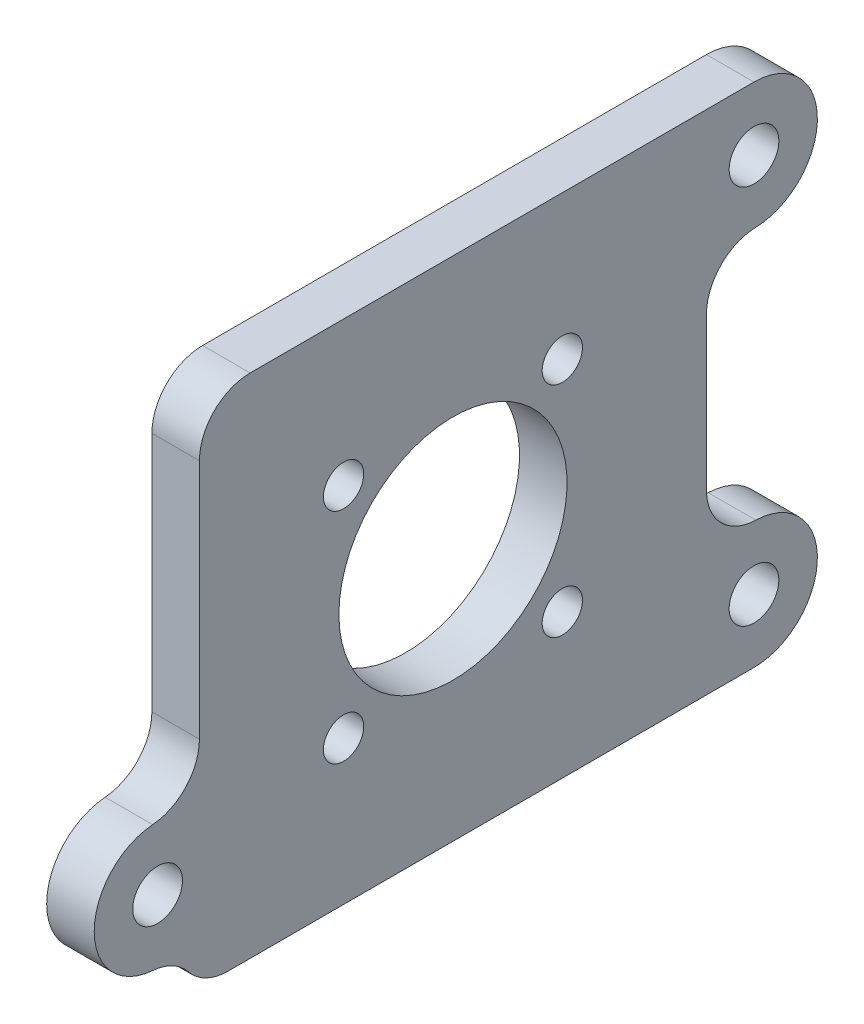
ISO-10303-21;
HEADER;
FILE_DESCRIPTION(('STEP AP214'),'2;1');
FILE_NAME('part.step','',(''),(''),'','','');
FILE_SCHEMA(('AUTOMOTIVE_DESIGN { 1 0 10303 214 1 1 1 1 }'));
ENDSEC;
DATA;
#1=APPLICATION_CONTEXT('core data for automotive mechanical design processes');
#2=APPLICATION_PROTOCOL_DEFINITION('international standard','automotive_design',2000,#1);
#3=PRODUCT_CONTEXT('',#1,'mechanical');
#4=PRODUCT('Part','Part','',(#3));
#5=PRODUCT_RELATED_PRODUCT_CATEGORY('part','',(#4));
#6=PRODUCT_DEFINITION_FORMATION('','',#4);
#7=PRODUCT_DEFINITION_CONTEXT('part definition',#1,'design');
#8=PRODUCT_DEFINITION('design','',#6,#7);
#9=PRODUCT_DEFINITION_SHAPE('','',#8);
#10=(LENGTH_UNIT() NAMED_UNIT(*) SI_UNIT(.MILLI.,.METRE.));
#11=(NAMED_UNIT(*) PLANE_ANGLE_UNIT() SI_UNIT($,.RADIAN.));
#12=(NAMED_UNIT(*) SI_UNIT($,.STERADIAN.) SOLID_ANGLE_UNIT());
#13=UNCERTAINTY_MEASURE_WITH_UNIT(LENGTH_MEASURE(1.E-05),#10,'distance_accuracy_value','');
#14=(GEOMETRIC_REPRESENTATION_CONTEXT(3) GLOBAL_UNCERTAINTY_ASSIGNED_CONTEXT((#13)) GLOBAL_UNIT_ASSIGNED_CONTEXT((#10,
#11,#12)) REPRESENTATION_CONTEXT('',''));
#15=CARTESIAN_POINT('',(0.,0.,0.));
#16=DIRECTION('',(0.,0.,1.));
#17=DIRECTION('',(1.,0.,0.));
#18=AXIS2_PLACEMENT_3D('',#15,#16,#17);
#19=CARTESIAN_POINT('',(4.7625,7.62441057319142,-30.48));
#20=DIRECTION('',(-1.,0.,0.));
#21=DIRECTION('',(0.,0.,1.));
#22=AXIS2_PLACEMENT_3D('',#19,#20,#21);
#23=PLANE('',#22);
#24=CARTESIAN_POINT('',(4.7625,-15.24,29.591));
#25=DIRECTION('',(1.,0.,0.));
#26=DIRECTION('',(0.,0.,-1.));
#27=AXIS2_PLACEMENT_3D('',#24,#25,#26);
#28=CIRCLE('',#27,2.4892);
#29=CARTESIAN_POINT('',(4.7625,-15.24,27.1018));
#30=VERTEX_POINT('',#29);
#31=EDGE_CURVE('E181',#30,#30,#28,.T.);
#32=ORIENTED_EDGE('',*,*,#31,.F.);
#33=EDGE_LOOP('',(#32));
#34=FACE_BOUND('',#33,.T.);
#35=CARTESIAN_POINT('',(4.7625,19.05,-30.1625));
#36=DIRECTION('',(1.,0.,0.));
#37=DIRECTION('',(0.,0.,-1.));
#38=AXIS2_PLACEMENT_3D('',#35,#36,#37);
#39=CIRCLE('',#38,2.4892);
#40=CARTESIAN_POINT('',(4.7625,19.05,-32.6517));
#41=VERTEX_POINT('',#40);
#42=EDGE_CURVE('E199',#41,#41,#39,.T.);
#43=ORIENTED_EDGE('',*,*,#42,.F.);
#44=EDGE_LOOP('',(#43));
#45=FACE_BOUND('',#44,.T.);
#46=CARTESIAN_POINT('',(4.7625,-19.05,-30.1625));
#47=DIRECTION('',(1.,0.,0.));
#48=DIRECTION('',(0.,0.,-1.));
#49=AXIS2_PLACEMENT_3D('',#46,#47,#48);
#50=CIRCLE('',#49,2.4892);
#51=CARTESIAN_POINT('',(4.7625,-19.05,-32.6517));
#52=VERTEX_POINT('',#51);
#53=EDGE_CURVE('E205',#52,#52,#50,.T.);
#54=ORIENTED_EDGE('',*,*,#53,.F.);
#55=EDGE_LOOP('',(#54));
#56=FACE_BOUND('',#55,.T.);
#57=CARTESIAN_POINT('',(4.7625,10.9601,10.9601));
#58=DIRECTION('',(1.,0.,0.));
#59=DIRECTION('',(0.,0.,-1.));
#60=AXIS2_PLACEMENT_3D('',#57,#58,#59);
#61=CIRCLE('',#60,2.0193);
#62=CARTESIAN_POINT('',(4.7625,10.9601,8.9408));
#63=VERTEX_POINT('',#62);
#64=EDGE_CURVE('E211',#63,#63,#61,.T.);
#65=ORIENTED_EDGE('',*,*,#64,.F.);
#66=EDGE_LOOP('',(#65));
#67=FACE_BOUND('',#66,.T.);
#68=CARTESIAN_POINT('',(4.7625,-10.9601,10.9601));
#69=DIRECTION('',(1.,0.,0.));
#70=DIRECTION('',(0.,0.,-1.));
#71=AXIS2_PLACEMENT_3D('',#68,#69,#70);
#72=CIRCLE('',#71,2.0193);
#73=CARTESIAN_POINT('',(4.7625,-10.9601,8.94079999999999));
#74=VERTEX_POINT('',#73);
#75=EDGE_CURVE('E214',#74,#74,#72,.T.);
#76=ORIENTED_EDGE('',*,*,#75,.F.);
#77=EDGE_LOOP('',(#76));
#78=FACE_BOUND('',#77,.T.);
#79=CARTESIAN_POINT('',(4.7625,-10.9601,-10.9601));
#80=DIRECTION('',(1.,0.,0.));
#81=DIRECTION('',(0.,0.,-1.));
#82=AXIS2_PLACEMENT_3D('',#79,#80,#81);
#83=CIRCLE('',#82,2.0193);
#84=CARTESIAN_POINT('',(4.7625,-10.9601,-12.9794));
#85=VERTEX_POINT('',#84);
#86=EDGE_CURVE('E217',#85,#85,#83,.T.);
#87=ORIENTED_EDGE('',*,*,#86,.F.);
#88=EDGE_LOOP('',(#87));
#89=FACE_BOUND('',#88,.T.);
#90=CARTESIAN_POINT('',(4.7625,10.9601,-10.9601));
#91=DIRECTION('',(1.,0.,0.));
#92=DIRECTION('',(0.,0.,-1.));
#93=AXIS2_PLACEMENT_3D('',#90,#91,#92);
#94=CIRCLE('',#93,2.0193);
#95=CARTESIAN_POINT('',(4.7625,10.9601,-12.9794));
#96=VERTEX_POINT('',#95);
#97=EDGE_CURVE('E220',#96,#96,#94,.T.);
#98=ORIENTED_EDGE('',*,*,#97,.F.);
#99=EDGE_LOOP('',(#98));
#100=FACE_BOUND('',#99,.T.);
#101=CARTESIAN_POINT('',(4.7625,-26.63537533388,30.48));
#102=DIRECTION('',(-1.,0.,0.));
#103=DIRECTION('',(0.,0.,1.));
#104=AXIS2_PLACEMENT_3D('',#101,#102,#103);
#105=CIRCLE('',#104,5.08);
#106=CARTESIAN_POINT('',(4.7625,-21.5707640743778,30.0848888888889));
#107=VERTEX_POINT('',#106);
#108=CARTESIAN_POINT('',(4.7625,-23.47768766694,26.5006271099512));
#109=VERTEX_POINT('',#108);
#110=EDGE_CURVE('E236',#107,#109,#105,.T.);
#111=ORIENTED_EDGE('',*,*,#110,.T.);
#112=CARTESIAN_POINT('',(4.7625,-20.3200000000001,22.5212542199024));
#113=DIRECTION('',(-1.,0.,0.));
#114=DIRECTION('',(0.,0.,1.));
#115=AXIS2_PLACEMENT_3D('',#112,#113,#114);
#116=CIRCLE('',#115,5.08);
#117=CARTESIAN_POINT('',(4.7625,-25.4,22.5212542199024));
#118=VERTEX_POINT('',#117);
#119=EDGE_CURVE('E176',#109,#118,#116,.F.);
#120=ORIENTED_EDGE('',*,*,#119,.T.);
#121=DIRECTION('',(0.,0.,-1.));
#122=VECTOR('',#121,1.);
#123=CARTESIAN_POINT('',(4.7625,-25.4,25.4));
#124=LINE('',#123,#122);
#125=CARTESIAN_POINT('',(4.7625,-25.4,-30.1625));
#126=VERTEX_POINT('',#125);
#127=EDGE_CURVE('E238',#118,#126,#124,.T.);
#128=ORIENTED_EDGE('',*,*,#127,.T.);
#129=CARTESIAN_POINT('',(4.7625,-19.05,-30.1625));
#130=DIRECTION('',(1.,0.,0.));
#131=DIRECTION('',(0.,0.,-1.));
#132=AXIS2_PLACEMENT_3D('',#129,#130,#131);
#133=CIRCLE('',#132,6.35);
#134=CARTESIAN_POINT('',(4.7625,-12.7024503184397,-30.3388888888889));
#135=VERTEX_POINT('',#134);
#136=EDGE_CURVE('E240',#126,#135,#133,.T.);
#137=ORIENTED_EDGE('',*,*,#136,.T.);
#138=CARTESIAN_POINT('',(4.7625,-7.62441057319142,-30.48));
#139=DIRECTION('',(-1.,0.,0.));
#140=DIRECTION('',(0.,0.,-1.));
#141=AXIS2_PLACEMENT_3D('',#138,#139,#140);
#142=CIRCLE('',#141,5.08);
#143=CARTESIAN_POINT('',(4.7625,-7.62441057319142,-25.4));
#144=VERTEX_POINT('',#143);
#145=EDGE_CURVE('E242',#135,#144,#142,.T.);
#146=ORIENTED_EDGE('',*,*,#145,.T.);
#147=DIRECTION('',(0.,1.,0.));
#148=VECTOR('',#147,1.);
#149=CARTESIAN_POINT('',(4.7625,7.62441057319142,-25.4));
#150=LINE('',#149,#148);
#151=CARTESIAN_POINT('',(4.7625,7.62441057319142,-25.4));
#152=VERTEX_POINT('',#151);
#153=EDGE_CURVE('E152',#144,#152,#150,.T.);
#154=ORIENTED_EDGE('',*,*,#153,.T.);
#155=CARTESIAN_POINT('',(4.7625,7.62441057319142,-30.48));
#156=DIRECTION('',(-1.,0.,0.));
#157=DIRECTION('',(0.,0.,1.));
#158=AXIS2_PLACEMENT_3D('',#155,#156,#157);
#159=CIRCLE('',#158,5.08);
#160=CARTESIAN_POINT('',(4.7625,12.7024503184397,-30.3388888888889));
#161=VERTEX_POINT('',#160);
#162=EDGE_CURVE('E146',#152,#161,#159,.T.);
#163=ORIENTED_EDGE('',*,*,#162,.T.);
#164=CARTESIAN_POINT('',(4.7625,19.05,-30.1625));
#165=DIRECTION('',(1.,0.,0.));
#166=DIRECTION('',(0.,0.,-1.));
#167=AXIS2_PLACEMENT_3D('',#164,#165,#166);
#168=CIRCLE('',#167,6.35);
#169=CARTESIAN_POINT('',(4.7625,25.4,-30.1625));
#170=VERTEX_POINT('',#169);
#171=EDGE_CURVE('E136',#161,#170,#168,.T.);
#172=ORIENTED_EDGE('',*,*,#171,.T.);
#173=DIRECTION('',(0.,0.,1.));
#174=VECTOR('',#173,1.);
#175=CARTESIAN_POINT('',(4.7625,25.4,-25.4));
#176=LINE('',#175,#174);
#177=CARTESIAN_POINT('',(4.7625,25.3999999999999,20.32));
#178=VERTEX_POINT('',#177);
#179=EDGE_CURVE('E145',#170,#178,#176,.T.);
#180=ORIENTED_EDGE('',*,*,#179,.T.);
#181=CARTESIAN_POINT('',(4.7625,20.32,20.32));
#182=DIRECTION('',(-1.,0.,0.));
#183=DIRECTION('',(0.,0.,1.));
#184=AXIS2_PLACEMENT_3D('',#181,#182,#183);
#185=CIRCLE('',#184,5.08);
#186=CARTESIAN_POINT('',(4.7625,20.32,25.4));
#187=VERTEX_POINT('',#186);
#188=EDGE_CURVE('E56',#178,#187,#185,.F.);
#189=ORIENTED_EDGE('',*,*,#188,.T.);
#190=DIRECTION('',(0.,-1.,0.));
#191=VECTOR('',#190,1.);
#192=CARTESIAN_POINT('',(4.7625,25.4,25.4));
#193=LINE('',#192,#191);
#194=CARTESIAN_POINT('',(4.7625,-3.84462466612003,25.4));
#195=VERTEX_POINT('',#194);
#196=EDGE_CURVE('E230',#187,#195,#193,.T.);
#197=ORIENTED_EDGE('',*,*,#196,.T.);
#198=CARTESIAN_POINT('',(4.7625,-3.84462466612003,30.48));
#199=DIRECTION('',(-1.,0.,0.));
#200=DIRECTION('',(0.,0.,-1.));
#201=AXIS2_PLACEMENT_3D('',#198,#199,#200);
#202=CIRCLE('',#201,5.08);
#203=CARTESIAN_POINT('',(4.7625,-8.90923592562224,30.0848888888889));
#204=VERTEX_POINT('',#203);
#205=EDGE_CURVE('E232',#195,#204,#202,.T.);
#206=ORIENTED_EDGE('',*,*,#205,.T.);
#207=CARTESIAN_POINT('',(4.7625,-15.24,29.591));
#208=DIRECTION('',(1.,0.,0.));
#209=DIRECTION('',(0.,0.,-1.));
#210=AXIS2_PLACEMENT_3D('',#207,#208,#209);
#211=CIRCLE('',#210,6.35);
#212=EDGE_CURVE('E234',#204,#107,#211,.T.);
#213=ORIENTED_EDGE('',*,*,#212,.T.);
#214=EDGE_LOOP('',(#111,#120,#128,#137,#146,#154,#163,#172,#180,#189,#197,#206,#213));
#215=FACE_BOUND('',#214,.T.);
#216=CARTESIAN_POINT('',(4.7625,0.,0.));
#217=DIRECTION('',(1.,0.,0.));
#218=DIRECTION('',(0.,0.,-1.));
#219=AXIS2_PLACEMENT_3D('',#216,#217,#218);
#220=CIRCLE('',#219,11.43);
#221=CARTESIAN_POINT('',(4.7625,0.,11.43));
#222=VERTEX_POINT('',#221);
#223=EDGE_CURVE('E224',#222,#222,#220,.T.);
#224=ORIENTED_EDGE('',*,*,#223,.F.);
#225=EDGE_LOOP('',(#224));
#226=FACE_BOUND('',#225,.T.);
#227=ADVANCED_FACE('F39',(#34,#45,#56,#67,#78,#89,#100,#215,#226),#23,.F.);
#228=CARTESIAN_POINT('',(0.,7.62441057319142,-30.48));
#229=DIRECTION('',(-1.,0.,0.));
#230=DIRECTION('',(0.,0.,1.));
#231=AXIS2_PLACEMENT_3D('',#228,#229,#230);
#232=PLANE('',#231);
#233=CARTESIAN_POINT('',(0.,-10.9601,10.9601));
#234=DIRECTION('',(-1.,0.,0.));
#235=DIRECTION('',(0.,0.,1.));
#236=AXIS2_PLACEMENT_3D('',#233,#234,#235);
#237=CIRCLE('',#236,3.5433);
#238=CARTESIAN_POINT('',(0.,-10.9601,14.5034));
#239=VERTEX_POINT('',#238);
#240=EDGE_CURVE('E594',#239,#239,#237,.T.);
#241=ORIENTED_EDGE('',*,*,#240,.F.);
#242=EDGE_LOOP('',(#241));
#243=FACE_BOUND('',#242,.T.);
#244=CARTESIAN_POINT('',(0.,-10.9601,-10.9601));
#245=DIRECTION('',(-1.,0.,0.));
#246=DIRECTION('',(0.,0.,1.));
#247=AXIS2_PLACEMENT_3D('',#244,#245,#246);
#248=CIRCLE('',#247,3.5433);
#249=CARTESIAN_POINT('',(0.,-10.9601,-7.41680000000001));
#250=VERTEX_POINT('',#249);
#251=EDGE_CURVE('E598',#250,#250,#248,.T.);
#252=ORIENTED_EDGE('',*,*,#251,.F.);
#253=EDGE_LOOP('',(#252));
#254=FACE_BOUND('',#253,.T.);
#255=CARTESIAN_POINT('',(0.,10.9601,-10.9601));
#256=DIRECTION('',(-1.,0.,0.));
#257=DIRECTION('',(0.,0.,1.));
#258=AXIS2_PLACEMENT_3D('',#255,#256,#257);
#259=CIRCLE('',#258,3.5433);
#260=CARTESIAN_POINT('',(0.,10.9601,-7.41680000000001));
#261=VERTEX_POINT('',#260);
#262=EDGE_CURVE('E193',#261,#261,#259,.T.);
#263=ORIENTED_EDGE('',*,*,#262,.F.);
#264=EDGE_LOOP('',(#263));
#265=FACE_BOUND('',#264,.T.);
#266=CARTESIAN_POINT('',(0.,10.9601,10.9601));
#267=DIRECTION('',(-1.,0.,0.));
#268=DIRECTION('',(0.,0.,1.));
#269=AXIS2_PLACEMENT_3D('',#266,#267,#268);
#270=CIRCLE('',#269,3.5433);
#271=CARTESIAN_POINT('',(0.,10.9601,14.5034));
#272=VERTEX_POINT('',#271);
#273=EDGE_CURVE('E182',#272,#272,#270,.T.);
#274=ORIENTED_EDGE('',*,*,#273,.F.);
#275=EDGE_LOOP('',(#274));
#276=FACE_BOUND('',#275,.T.);
#277=CARTESIAN_POINT('',(0.,-15.24,29.591));
#278=DIRECTION('',(1.,0.,0.));
#279=DIRECTION('',(0.,0.,-1.));
#280=AXIS2_PLACEMENT_3D('',#277,#278,#279);
#281=CIRCLE('',#280,2.4892);
#282=CARTESIAN_POINT('',(0.,-15.24,27.1018));
#283=VERTEX_POINT('',#282);
#284=EDGE_CURVE('E186',#283,#283,#281,.T.);
#285=ORIENTED_EDGE('',*,*,#284,.T.);
#286=EDGE_LOOP('',(#285));
#287=FACE_BOUND('',#286,.T.);
#288=CARTESIAN_POINT('',(0.,19.05,-30.1625));
#289=DIRECTION('',(1.,0.,0.));
#290=DIRECTION('',(0.,0.,-1.));
#291=AXIS2_PLACEMENT_3D('',#288,#289,#290);
#292=CIRCLE('',#291,2.4892);
#293=CARTESIAN_POINT('',(0.,19.05,-32.6517));
#294=VERTEX_POINT('',#293);
#295=EDGE_CURVE('E202',#294,#294,#292,.T.);
#296=ORIENTED_EDGE('',*,*,#295,.T.);
#297=EDGE_LOOP('',(#296));
#298=FACE_BOUND('',#297,.T.);
#299=CARTESIAN_POINT('',(0.,-19.05,-30.1625));
#300=DIRECTION('',(1.,0.,0.));
#301=DIRECTION('',(0.,0.,-1.));
#302=AXIS2_PLACEMENT_3D('',#299,#300,#301);
#303=CIRCLE('',#302,2.4892);
#304=CARTESIAN_POINT('',(0.,-19.05,-32.6517));
#305=VERTEX_POINT('',#304);
#306=EDGE_CURVE('E208',#305,#305,#303,.T.);
#307=ORIENTED_EDGE('',*,*,#306,.T.);
#308=EDGE_LOOP('',(#307));
#309=FACE_BOUND('',#308,.T.);
#310=DIRECTION('',(0.,0.,-1.));
#311=VECTOR('',#310,1.);
#312=CARTESIAN_POINT('',(0.,-25.4,-25.4));
#313=LINE('',#312,#311);
#314=CARTESIAN_POINT('',(0.,-25.4000000000001,22.5212542199024));
#315=VERTEX_POINT('',#314);
#316=CARTESIAN_POINT('',(0.,-25.4,-30.1625));
#317=VERTEX_POINT('',#316);
#318=EDGE_CURVE('E260',#315,#317,#313,.T.);
#319=ORIENTED_EDGE('',*,*,#318,.F.);
#320=CARTESIAN_POINT('',(0.,-20.3200000000001,22.5212542199024));
#321=DIRECTION('',(-1.,0.,0.));
#322=DIRECTION('',(0.,0.,1.));
#323=AXIS2_PLACEMENT_3D('',#320,#321,#322);
#324=CIRCLE('',#323,5.08);
#325=CARTESIAN_POINT('',(0.,-23.47768766694,26.5006271099512));
#326=VERTEX_POINT('',#325);
#327=EDGE_CURVE('E171',#315,#326,#324,.T.);
#328=ORIENTED_EDGE('',*,*,#327,.T.);
#329=CARTESIAN_POINT('',(0.,-26.63537533388,30.48));
#330=DIRECTION('',(-1.,0.,0.));
#331=DIRECTION('',(0.,0.,1.));
#332=AXIS2_PLACEMENT_3D('',#329,#330,#331);
#333=CIRCLE('',#332,5.08);
#334=CARTESIAN_POINT('',(0.,-21.5707640743778,30.0848888888889));
#335=VERTEX_POINT('',#334);
#336=EDGE_CURVE('E257',#335,#326,#333,.T.);
#337=ORIENTED_EDGE('',*,*,#336,.F.);
#338=CARTESIAN_POINT('',(0.,-15.24,29.591));
#339=DIRECTION('',(1.,0.,0.));
#340=DIRECTION('',(0.,0.,-1.));
#341=AXIS2_PLACEMENT_3D('',#338,#339,#340);
#342=CIRCLE('',#341,6.35);
#343=CARTESIAN_POINT('',(0.,-8.90923592562224,30.0848888888889));
#344=VERTEX_POINT('',#343);
#345=EDGE_CURVE('E255',#344,#335,#342,.T.);
#346=ORIENTED_EDGE('',*,*,#345,.F.);
#347=CARTESIAN_POINT('',(0.,-3.84462466612003,30.48));
#348=DIRECTION('',(-1.,0.,0.));
#349=DIRECTION('',(0.,0.,-1.));
#350=AXIS2_PLACEMENT_3D('',#347,#348,#349);
#351=CIRCLE('',#350,5.08);
#352=CARTESIAN_POINT('',(0.,-3.84462466612003,25.4));
#353=VERTEX_POINT('',#352);
#354=EDGE_CURVE('E253',#353,#344,#351,.T.);
#355=ORIENTED_EDGE('',*,*,#354,.F.);
#356=DIRECTION('',(0.,-1.,0.));
#357=VECTOR('',#356,1.);
#358=CARTESIAN_POINT('',(0.,25.4,25.4));
#359=LINE('',#358,#357);
#360=CARTESIAN_POINT('',(0.,20.32,25.4));
#361=VERTEX_POINT('',#360);
#362=EDGE_CURVE('E251',#361,#353,#359,.T.);
#363=ORIENTED_EDGE('',*,*,#362,.F.);
#364=CARTESIAN_POINT('',(0.,20.32,20.32));
#365=DIRECTION('',(-1.,0.,0.));
#366=DIRECTION('',(0.,0.,1.));
#367=AXIS2_PLACEMENT_3D('',#364,#365,#366);
#368=CIRCLE('',#367,5.08);
#369=CARTESIAN_POINT('',(0.,25.4,20.32));
#370=VERTEX_POINT('',#369);
#371=EDGE_CURVE('E164',#361,#370,#368,.T.);
#372=ORIENTED_EDGE('',*,*,#371,.T.);
#373=DIRECTION('',(0.,0.,1.));
#374=VECTOR('',#373,1.);
#375=CARTESIAN_POINT('',(0.,25.4,25.4));
#376=LINE('',#375,#374);
#377=CARTESIAN_POINT('',(0.,25.4,-30.1625));
#378=VERTEX_POINT('',#377);
#379=EDGE_CURVE('E249',#378,#370,#376,.T.);
#380=ORIENTED_EDGE('',*,*,#379,.F.);
#381=CARTESIAN_POINT('',(0.,19.05,-30.1625));
#382=DIRECTION('',(1.,0.,0.));
#383=DIRECTION('',(0.,0.,-1.));
#384=AXIS2_PLACEMENT_3D('',#381,#382,#383);
#385=CIRCLE('',#384,6.35);
#386=CARTESIAN_POINT('',(0.,12.7024503184397,-30.3388888888889));
#387=VERTEX_POINT('',#386);
#388=EDGE_CURVE('E247',#387,#378,#385,.T.);
#389=ORIENTED_EDGE('',*,*,#388,.F.);
#390=CARTESIAN_POINT('',(0.,7.62441057319142,-30.48));
#391=DIRECTION('',(-1.,0.,0.));
#392=DIRECTION('',(0.,0.,1.));
#393=AXIS2_PLACEMENT_3D('',#390,#391,#392);
#394=CIRCLE('',#393,5.08);
#395=CARTESIAN_POINT('',(0.,7.62441057319142,-25.4));
#396=VERTEX_POINT('',#395);
#397=EDGE_CURVE('E160',#396,#387,#394,.T.);
#398=ORIENTED_EDGE('',*,*,#397,.F.);
#399=DIRECTION('',(0.,1.,0.));
#400=VECTOR('',#399,1.);
#401=CARTESIAN_POINT('',(0.,7.62441057319142,-25.4));
#402=LINE('',#401,#400);
#403=CARTESIAN_POINT('',(0.,-7.62441057319142,-25.4));
#404=VERTEX_POINT('',#403);
#405=EDGE_CURVE('E156',#404,#396,#402,.T.);
#406=ORIENTED_EDGE('',*,*,#405,.F.);
#407=CARTESIAN_POINT('',(0.,-7.62441057319142,-30.48));
#408=DIRECTION('',(-1.,0.,0.));
#409=DIRECTION('',(0.,0.,-1.));
#410=AXIS2_PLACEMENT_3D('',#407,#408,#409);
#411=CIRCLE('',#410,5.08);
#412=CARTESIAN_POINT('',(0.,-12.7024503184397,-30.3388888888889));
#413=VERTEX_POINT('',#412);
#414=EDGE_CURVE('E264',#413,#404,#411,.T.);
#415=ORIENTED_EDGE('',*,*,#414,.F.);
#416=CARTESIAN_POINT('',(0.,-19.05,-30.1625));
#417=DIRECTION('',(1.,0.,0.));
#418=DIRECTION('',(0.,0.,-1.));
#419=AXIS2_PLACEMENT_3D('',#416,#417,#418);
#420=CIRCLE('',#419,6.35);
#421=EDGE_CURVE('E262',#317,#413,#420,.T.);
#422=ORIENTED_EDGE('',*,*,#421,.F.);
#423=EDGE_LOOP('',(#319,#328,#337,#346,#355,#363,#372,#380,#389,#398,#406,#415,#422));
#424=FACE_BOUND('',#423,.T.);
#425=CARTESIAN_POINT('',(0.,0.,0.));
#426=DIRECTION('',(1.,0.,0.));
#427=DIRECTION('',(0.,0.,-1.));
#428=AXIS2_PLACEMENT_3D('',#425,#426,#427);
#429=CIRCLE('',#428,11.43);
#430=CARTESIAN_POINT('',(0.,0.,11.43));
#431=VERTEX_POINT('',#430);
#432=EDGE_CURVE('E223',#431,#431,#429,.T.);
#433=ORIENTED_EDGE('',*,*,#432,.T.);
#434=EDGE_LOOP('',(#433));
#435=FACE_BOUND('',#434,.T.);
#436=ADVANCED_FACE('F294',(#243,#254,#265,#276,#287,#298,#309,#424,#435),#232,.T.);
#437=CARTESIAN_POINT('',(4.7625,7.62441057319142,-30.48));
#438=DIRECTION('',(-1.,0.,0.));
#439=DIRECTION('',(0.,0.,1.));
#440=AXIS2_PLACEMENT_3D('',#437,#438,#439);
#441=CYLINDRICAL_SURFACE('',#440,5.08);
#442=ORIENTED_EDGE('',*,*,#397,.T.);
#443=DIRECTION('',(-1.,0.,0.));
#444=VECTOR('',#443,1.);
#445=CARTESIAN_POINT('',(4.7625,12.7024503184397,-30.3388888888889));
#446=LINE('',#445,#444);
#447=EDGE_CURVE('E141',#161,#387,#446,.T.);
#448=ORIENTED_EDGE('',*,*,#447,.F.);
#449=ORIENTED_EDGE('',*,*,#162,.F.);
#450=DIRECTION('',(-1.,0.,0.));
#451=VECTOR('',#450,1.);
#452=CARTESIAN_POINT('',(4.7625,7.62441057319142,-25.4));
#453=LINE('',#452,#451);
#454=EDGE_CURVE('E245',#152,#396,#453,.T.);
#455=ORIENTED_EDGE('',*,*,#454,.T.);
#456=EDGE_LOOP('',(#442,#448,#449,#455));
#457=FACE_BOUND('',#456,.T.);
#458=ADVANCED_FACE('F158',(#457),#441,.F.);
#459=CARTESIAN_POINT('',(4.7625,19.05,-30.1625));
#460=DIRECTION('',(-1.,0.,0.));
#461=DIRECTION('',(0.,0.,1.));
#462=AXIS2_PLACEMENT_3D('',#459,#460,#461);
#463=CYLINDRICAL_SURFACE('',#462,6.35);
#464=ORIENTED_EDGE('',*,*,#388,.T.);
#465=DIRECTION('',(-1.,0.,0.));
#466=VECTOR('',#465,1.);
#467=CARTESIAN_POINT('',(4.7625,25.4,-30.1625));
#468=LINE('',#467,#466);
#469=EDGE_CURVE('E144',#170,#378,#468,.T.);
#470=ORIENTED_EDGE('',*,*,#469,.F.);
#471=ORIENTED_EDGE('',*,*,#171,.F.);
#472=ORIENTED_EDGE('',*,*,#447,.T.);
#473=EDGE_LOOP('',(#464,#470,#471,#472));
#474=FACE_BOUND('',#473,.T.);
#475=ADVANCED_FACE('F139',(#474),#463,.T.);
#476=CARTESIAN_POINT('',(4.7625,25.4,25.4));
#477=DIRECTION('',(0.,-1.,0.));
#478=DIRECTION('',(0.,0.,-1.));
#479=AXIS2_PLACEMENT_3D('',#476,#477,#478);
#480=PLANE('',#479);
#481=ORIENTED_EDGE('',*,*,#379,.T.);
#482=DIRECTION('',(-1.,0.,0.));
#483=VECTOR('',#482,1.);
#484=CARTESIAN_POINT('',(4.7625,25.4,20.32));
#485=LINE('',#484,#483);
#486=EDGE_CURVE('E11',#370,#178,#485,.F.);
#487=ORIENTED_EDGE('',*,*,#486,.T.);
#488=ORIENTED_EDGE('',*,*,#179,.F.);
#489=ORIENTED_EDGE('',*,*,#469,.T.);
#490=EDGE_LOOP('',(#481,#487,#488,#489));
#491=FACE_BOUND('',#490,.T.);
#492=ADVANCED_FACE('F326',(#491),#480,.F.);
#493=CARTESIAN_POINT('',(4.7625,25.4,25.4));
#494=DIRECTION('',(0.,0.,-1.));
#495=DIRECTION('',(0.,1.,0.));
#496=AXIS2_PLACEMENT_3D('',#493,#494,#495);
#497=PLANE('',#496);
#498=ORIENTED_EDGE('',*,*,#196,.F.);
#499=DIRECTION('',(-1.,0.,0.));
#500=VECTOR('',#499,1.);
#501=CARTESIAN_POINT('',(4.7625,20.32,25.4));
#502=LINE('',#501,#500);
#503=EDGE_CURVE('E48',#187,#361,#502,.T.);
#504=ORIENTED_EDGE('',*,*,#503,.T.);
#505=ORIENTED_EDGE('',*,*,#362,.T.);
#506=DIRECTION('',(-1.,0.,0.));
#507=VECTOR('',#506,1.);
#508=CARTESIAN_POINT('',(4.7625,-3.84462466612003,25.4));
#509=LINE('',#508,#507);
#510=EDGE_CURVE('E166',#195,#353,#509,.T.);
#511=ORIENTED_EDGE('',*,*,#510,.F.);
#512=EDGE_LOOP('',(#498,#504,#505,#511));
#513=FACE_BOUND('',#512,.T.);
#514=ADVANCED_FACE('F329',(#513),#497,.F.);
#515=CARTESIAN_POINT('',(4.7625,-3.84462466612003,30.48));
#516=DIRECTION('',(-1.,0.,0.));
#517=DIRECTION('',(0.,0.,1.));
#518=AXIS2_PLACEMENT_3D('',#515,#516,#517);
#519=CYLINDRICAL_SURFACE('',#518,5.08);
#520=ORIENTED_EDGE('',*,*,#354,.T.);
#521=DIRECTION('',(-1.,0.,0.));
#522=VECTOR('',#521,1.);
#523=CARTESIAN_POINT('',(4.7625,-8.90923592562224,30.0848888888889));
#524=LINE('',#523,#522);
#525=EDGE_CURVE('E280',#204,#344,#524,.T.);
#526=ORIENTED_EDGE('',*,*,#525,.F.);
#527=ORIENTED_EDGE('',*,*,#205,.F.);
#528=ORIENTED_EDGE('',*,*,#510,.T.);
#529=EDGE_LOOP('',(#520,#526,#527,#528));
#530=FACE_BOUND('',#529,.T.);
#531=ADVANCED_FACE('F287',(#530),#519,.F.);
#532=CARTESIAN_POINT('',(4.7625,-15.24,29.591));
#533=DIRECTION('',(-1.,0.,0.));
#534=DIRECTION('',(0.,0.,1.));
#535=AXIS2_PLACEMENT_3D('',#532,#533,#534);
#536=CYLINDRICAL_SURFACE('',#535,6.35);
#537=ORIENTED_EDGE('',*,*,#345,.T.);
#538=DIRECTION('',(-1.,0.,0.));
#539=VECTOR('',#538,1.);
#540=CARTESIAN_POINT('',(4.7625,-21.5707640743778,30.0848888888889));
#541=LINE('',#540,#539);
#542=EDGE_CURVE('E277',#107,#335,#541,.T.);
#543=ORIENTED_EDGE('',*,*,#542,.F.);
#544=ORIENTED_EDGE('',*,*,#212,.F.);
#545=ORIENTED_EDGE('',*,*,#525,.T.);
#546=EDGE_LOOP('',(#537,#543,#544,#545));
#547=FACE_BOUND('',#546,.T.);
#548=ADVANCED_FACE('F299',(#547),#536,.T.);
#549=CARTESIAN_POINT('',(4.7625,-26.63537533388,30.48));
#550=DIRECTION('',(-1.,0.,0.));
#551=DIRECTION('',(0.,0.,1.));
#552=AXIS2_PLACEMENT_3D('',#549,#550,#551);
#553=CYLINDRICAL_SURFACE('',#552,5.08);
#554=ORIENTED_EDGE('',*,*,#336,.T.);
#555=DIRECTION('',(-1.,0.,0.));
#556=VECTOR('',#555,1.);
#557=CARTESIAN_POINT('',(4.7625,-23.47768766694,26.5006271099512));
#558=LINE('',#557,#556);
#559=EDGE_CURVE('E173',#326,#109,#558,.F.);
#560=ORIENTED_EDGE('',*,*,#559,.T.);
#561=ORIENTED_EDGE('',*,*,#110,.F.);
#562=ORIENTED_EDGE('',*,*,#542,.T.);
#563=EDGE_LOOP('',(#554,#560,#561,#562));
#564=FACE_BOUND('',#563,.T.);
#565=ADVANCED_FACE('F303',(#564),#553,.F.);
#566=CARTESIAN_POINT('',(4.7625,-25.4,-25.4));
#567=DIRECTION('',(0.,1.,0.));
#568=DIRECTION('',(0.,0.,1.));
#569=AXIS2_PLACEMENT_3D('',#566,#567,#568);
#570=PLANE('',#569);
#571=ORIENTED_EDGE('',*,*,#127,.F.);
#572=DIRECTION('',(-1.,0.,0.));
#573=VECTOR('',#572,1.);
#574=CARTESIAN_POINT('',(4.7625,-25.4000000000001,22.5212542199024));
#575=LINE('',#574,#573);
#576=EDGE_CURVE('E161',#118,#315,#575,.T.);
#577=ORIENTED_EDGE('',*,*,#576,.T.);
#578=ORIENTED_EDGE('',*,*,#318,.T.);
#579=DIRECTION('',(-1.,0.,0.));
#580=VECTOR('',#579,1.);
#581=CARTESIAN_POINT('',(4.7625,-25.4,-30.1625));
#582=LINE('',#581,#580);
#583=EDGE_CURVE('E274',#126,#317,#582,.T.);
#584=ORIENTED_EDGE('',*,*,#583,.F.);
#585=EDGE_LOOP('',(#571,#577,#578,#584));
#586=FACE_BOUND('',#585,.T.);
#587=ADVANCED_FACE('F311',(#586),#570,.F.);
#588=CARTESIAN_POINT('',(4.7625,-19.05,-30.1625));
#589=DIRECTION('',(-1.,0.,0.));
#590=DIRECTION('',(0.,0.,1.));
#591=AXIS2_PLACEMENT_3D('',#588,#589,#590);
#592=CYLINDRICAL_SURFACE('',#591,6.35);
#593=ORIENTED_EDGE('',*,*,#421,.T.);
#594=DIRECTION('',(-1.,0.,0.));
#595=VECTOR('',#594,1.);
#596=CARTESIAN_POINT('',(4.7625,-12.7024503184397,-30.3388888888889));
#597=LINE('',#596,#595);
#598=EDGE_CURVE('E271',#135,#413,#597,.T.);
#599=ORIENTED_EDGE('',*,*,#598,.F.);
#600=ORIENTED_EDGE('',*,*,#136,.F.);
#601=ORIENTED_EDGE('',*,*,#583,.T.);
#602=EDGE_LOOP('',(#593,#599,#600,#601));
#603=FACE_BOUND('',#602,.T.);
#604=ADVANCED_FACE('F318',(#603),#592,.T.);
#605=CARTESIAN_POINT('',(4.7625,-7.62441057319142,-30.48));
#606=DIRECTION('',(-1.,0.,0.));
#607=DIRECTION('',(0.,0.,1.));
#608=AXIS2_PLACEMENT_3D('',#605,#606,#607);
#609=CYLINDRICAL_SURFACE('',#608,5.08);
#610=ORIENTED_EDGE('',*,*,#414,.T.);
#611=DIRECTION('',(-1.,0.,0.));
#612=VECTOR('',#611,1.);
#613=CARTESIAN_POINT('',(4.7625,-7.62441057319142,-25.4));
#614=LINE('',#613,#612);
#615=EDGE_CURVE('E268',#144,#404,#614,.T.);
#616=ORIENTED_EDGE('',*,*,#615,.F.);
#617=ORIENTED_EDGE('',*,*,#145,.F.);
#618=ORIENTED_EDGE('',*,*,#598,.T.);
#619=EDGE_LOOP('',(#610,#616,#617,#618));
#620=FACE_BOUND('',#619,.T.);
#621=ADVANCED_FACE('F322',(#620),#609,.F.);
#622=CARTESIAN_POINT('',(4.7625,7.62441057319142,-25.4));
#623=DIRECTION('',(0.,0.,1.));
#624=DIRECTION('',(0.,-1.,0.));
#625=AXIS2_PLACEMENT_3D('',#622,#623,#624);
#626=PLANE('',#625);
#627=ORIENTED_EDGE('',*,*,#405,.T.);
#628=ORIENTED_EDGE('',*,*,#454,.F.);
#629=ORIENTED_EDGE('',*,*,#153,.F.);
#630=ORIENTED_EDGE('',*,*,#615,.T.);
#631=EDGE_LOOP('',(#627,#628,#629,#630));
#632=FACE_BOUND('',#631,.T.);
#633=ADVANCED_FACE('F325',(#632),#626,.F.);
#634=CARTESIAN_POINT('',(4.7625,0.,0.));
#635=DIRECTION('',(-1.,0.,0.));
#636=DIRECTION('',(0.,0.,1.));
#637=AXIS2_PLACEMENT_3D('',#634,#635,#636);
#638=CYLINDRICAL_SURFACE('',#637,11.43);
#639=CARTESIAN_POINT('',(4.7625,0.,11.43));
#640=CARTESIAN_POINT('',(4.712890625,0.,11.43));
#641=CARTESIAN_POINT('',(4.66328125,0.,11.43));
#642=CARTESIAN_POINT('',(4.5640625,0.,11.43));
#643=CARTESIAN_POINT('',(4.514453125,0.,11.43));
#644=CARTESIAN_POINT('',(4.415234375,0.,11.43));
#645=CARTESIAN_POINT('',(4.365625,0.,11.43));
#646=CARTESIAN_POINT('',(4.26640625,0.,11.43));
#647=CARTESIAN_POINT('',(4.216796875,0.,11.43));
#648=CARTESIAN_POINT('',(4.117578125,0.,11.43));
#649=CARTESIAN_POINT('',(4.06796875,0.,11.43));
#650=CARTESIAN_POINT('',(3.96875,0.,11.43));
#651=CARTESIAN_POINT('',(3.919140625,0.,11.43));
#652=CARTESIAN_POINT('',(3.819921875,0.,11.43));
#653=CARTESIAN_POINT('',(3.7703125,0.,11.43));
#654=CARTESIAN_POINT('',(3.67109375,0.,11.43));
#655=CARTESIAN_POINT('',(3.621484375,0.,11.43));
#656=CARTESIAN_POINT('',(3.522265625,0.,11.43));
#657=CARTESIAN_POINT('',(3.47265625,0.,11.43));
#658=CARTESIAN_POINT('',(3.3734375,0.,11.43));
#659=CARTESIAN_POINT('',(3.323828125,0.,11.43));
#660=CARTESIAN_POINT('',(3.224609375,0.,11.43));
#661=CARTESIAN_POINT('',(3.175,0.,11.43));
#662=CARTESIAN_POINT('',(3.07578125,0.,11.43));
#663=CARTESIAN_POINT('',(3.026171875,0.,11.43));
#664=CARTESIAN_POINT('',(2.926953125,0.,11.43));
#665=CARTESIAN_POINT('',(2.87734375,0.,11.43));
#666=CARTESIAN_POINT('',(2.778125,0.,11.43));
#667=CARTESIAN_POINT('',(2.728515625,0.,11.43));
#668=CARTESIAN_POINT('',(2.629296875,0.,11.43));
#669=CARTESIAN_POINT('',(2.5796875,0.,11.43));
#670=CARTESIAN_POINT('',(2.48046875,0.,11.43));
#671=CARTESIAN_POINT('',(2.430859375,0.,11.43));
#672=CARTESIAN_POINT('',(2.331640625,0.,11.43));
#673=CARTESIAN_POINT('',(2.28203125,0.,11.43));
#674=CARTESIAN_POINT('',(2.1828125,0.,11.43));
#675=CARTESIAN_POINT('',(2.133203125,0.,11.43));
#676=CARTESIAN_POINT('',(2.033984375,0.,11.43));
#677=CARTESIAN_POINT('',(1.984375,0.,11.43));
#678=CARTESIAN_POINT('',(1.88515625,0.,11.43));
#679=CARTESIAN_POINT('',(1.835546875,0.,11.43));
#680=CARTESIAN_POINT('',(1.736328125,0.,11.43));
#681=CARTESIAN_POINT('',(1.68671875,0.,11.43));
#682=CARTESIAN_POINT('',(1.5875,0.,11.43));
#683=CARTESIAN_POINT('',(1.537890625,0.,11.43));
#684=CARTESIAN_POINT('',(1.438671875,0.,11.43));
#685=CARTESIAN_POINT('',(1.3890625,0.,11.43));
#686=CARTESIAN_POINT('',(1.28984375,0.,11.43));
#687=CARTESIAN_POINT('',(1.240234375,0.,11.43));
#688=CARTESIAN_POINT('',(1.141015625,0.,11.43));
#689=CARTESIAN_POINT('',(1.09140625,0.,11.43));
#690=CARTESIAN_POINT('',(0.9921875,0.,11.43));
#691=CARTESIAN_POINT('',(0.942578125,0.,11.43));
#692=CARTESIAN_POINT('',(0.843359375,0.,11.43));
#693=CARTESIAN_POINT('',(0.79375,0.,11.43));
#694=CARTESIAN_POINT('',(0.69453125,0.,11.43));
#695=CARTESIAN_POINT('',(0.644921875,0.,11.43));
#696=CARTESIAN_POINT('',(0.545703125,0.,11.43));
#697=CARTESIAN_POINT('',(0.49609375,0.,11.43));
#698=CARTESIAN_POINT('',(0.396875,0.,11.43));
#699=CARTESIAN_POINT('',(0.347265625,0.,11.43));
#700=CARTESIAN_POINT('',(0.248046875,0.,11.43));
#701=CARTESIAN_POINT('',(0.1984375,0.,11.43));
#702=CARTESIAN_POINT('',(0.09921875,0.,11.43));
#703=CARTESIAN_POINT('',(0.049609375,0.,11.43));
#704=CARTESIAN_POINT('',(0.,0.,11.43));
#705=B_SPLINE_CURVE_WITH_KNOTS('',3,(#639,#640,#641,#642,#643,#644,#645,#646,#647,#648,#649,
#650,#651,#652,#653,#654,#655,#656,#657,#658,#659,#660,#661,#662,#663,#664,#665,#666,#667,#668,
#669,#670,#671,#672,#673,#674,#675,#676,#677,#678,#679,#680,#681,#682,#683,#684,#685,#686,#687,
#688,#689,#690,#691,#692,#693,#694,#695,#696,#697,#698,#699,#700,#701,#702,#703,#704),
.UNSPECIFIED.,.F.,.F.,(4,2,2,2,2,2,2,2,2,2,2,2,2,2,2,2,2,2,2,2,2,2,2,2,2,2,2,2,2,2,2,2,4),(0.,
0.148828124999999,0.297656249999999,0.446484374999999,0.595312499999999,0.744140625,0.89296875,
1.041796875,1.190625,1.339453125,1.48828125,1.637109375,1.7859375,1.934765625,2.08359375,
2.232421875,2.38125,2.530078125,2.67890625,2.827734375,2.9765625,3.125390625,3.27421875,
3.423046875,3.571875,3.720703125,3.86953125,4.018359375,4.1671875,4.316015625,4.46484375,
4.613671875,4.7625),.UNSPECIFIED.);
#706=EDGE_CURVE('BSEAM350',#222,#431,#705,.T.);
#707=ORIENTED_EDGE('',*,*,#223,.T.);
#708=ORIENTED_EDGE('',*,*,#432,.F.);
#709=ORIENTED_EDGE('',*,*,#706,.T.);
#710=ORIENTED_EDGE('',*,*,#706,.F.);
#711=EDGE_LOOP('',(#707,#709,#708,#710));
#712=FACE_BOUND('',#711,.T.);
#713=ADVANCED_FACE('F350',(#712),#638,.F.);
#714=CARTESIAN_POINT('',(4.7625,10.9601,-10.9601));
#715=DIRECTION('',(1.,0.,0.));
#716=DIRECTION('',(0.,0.,-1.));
#717=AXIS2_PLACEMENT_3D('',#714,#715,#716);
#718=CYLINDRICAL_SURFACE('',#717,2.0193);
#719=CARTESIAN_POINT('',(1.27878783791418,10.9601,-10.9601));
#720=DIRECTION('',(-1.,0.,0.));
#721=DIRECTION('',(0.,0.,1.));
#722=AXIS2_PLACEMENT_3D('',#719,#720,#721);
#723=CIRCLE('',#722,2.0193);
#724=CARTESIAN_POINT('',(1.27878783791418,10.9601,-8.94080000000001));
#725=VERTEX_POINT('',#724);
#726=EDGE_CURVE('E43',#725,#725,#723,.T.);
#727=ORIENTED_EDGE('',*,*,#726,.T.);
#728=EDGE_LOOP('',(#727));
#729=FACE_BOUND('',#728,.T.);
#730=ORIENTED_EDGE('',*,*,#97,.T.);
#731=EDGE_LOOP('',(#730));
#732=FACE_BOUND('',#731,.T.);
#733=ADVANCED_FACE('F395',(#729,#732),#718,.F.);
#734=CARTESIAN_POINT('',(4.7625,-10.9601,-10.9601));
#735=DIRECTION('',(1.,0.,0.));
#736=DIRECTION('',(0.,0.,-1.));
#737=AXIS2_PLACEMENT_3D('',#734,#735,#736);
#738=CYLINDRICAL_SURFACE('',#737,2.0193);
#739=CARTESIAN_POINT('',(1.27878783791418,-10.9601,-10.9601));
#740=DIRECTION('',(-1.,0.,0.));
#741=DIRECTION('',(0.,0.,1.));
#742=AXIS2_PLACEMENT_3D('',#739,#740,#741);
#743=CIRCLE('',#742,2.0193);
#744=CARTESIAN_POINT('',(1.27878783791418,-10.9601,-8.94080000000001));
#745=VERTEX_POINT('',#744);
#746=EDGE_CURVE('E601',#745,#745,#743,.T.);
#747=ORIENTED_EDGE('',*,*,#746,.T.);
#748=EDGE_LOOP('',(#747));
#749=FACE_BOUND('',#748,.T.);
#750=ORIENTED_EDGE('',*,*,#86,.T.);
#751=EDGE_LOOP('',(#750));
#752=FACE_BOUND('',#751,.T.);
#753=ADVANCED_FACE('F405',(#749,#752),#738,.F.);
#754=CARTESIAN_POINT('',(4.7625,-10.9601,10.9601));
#755=DIRECTION('',(1.,0.,0.));
#756=DIRECTION('',(0.,0.,-1.));
#757=AXIS2_PLACEMENT_3D('',#754,#755,#756);
#758=CYLINDRICAL_SURFACE('',#757,2.0193);
#759=CARTESIAN_POINT('',(1.27878783791418,-10.9601,10.9601));
#760=DIRECTION('',(-1.,0.,0.));
#761=DIRECTION('',(0.,0.,1.));
#762=AXIS2_PLACEMENT_3D('',#759,#760,#761);
#763=CIRCLE('',#762,2.0193);
#764=CARTESIAN_POINT('',(1.27878783791418,-10.9601,12.9794));
#765=VERTEX_POINT('',#764);
#766=EDGE_CURVE('E597',#765,#765,#763,.T.);
#767=ORIENTED_EDGE('',*,*,#766,.T.);
#768=EDGE_LOOP('',(#767));
#769=FACE_BOUND('',#768,.T.);
#770=ORIENTED_EDGE('',*,*,#75,.T.);
#771=EDGE_LOOP('',(#770));
#772=FACE_BOUND('',#771,.T.);
#773=ADVANCED_FACE('F415',(#769,#772),#758,.F.);
#774=CARTESIAN_POINT('',(4.7625,10.9601,10.9601));
#775=DIRECTION('',(1.,0.,0.));
#776=DIRECTION('',(0.,0.,-1.));
#777=AXIS2_PLACEMENT_3D('',#774,#775,#776);
#778=CYLINDRICAL_SURFACE('',#777,2.0193);
#779=CARTESIAN_POINT('',(1.27878783791418,10.9601,10.9601));
#780=DIRECTION('',(-1.,0.,0.));
#781=DIRECTION('',(0.,0.,1.));
#782=AXIS2_PLACEMENT_3D('',#779,#780,#781);
#783=CIRCLE('',#782,2.0193);
#784=CARTESIAN_POINT('',(1.27878783791418,10.9601,12.9794));
#785=VERTEX_POINT('',#784);
#786=EDGE_CURVE('E179',#785,#785,#783,.T.);
#787=ORIENTED_EDGE('',*,*,#786,.T.);
#788=EDGE_LOOP('',(#787));
#789=FACE_BOUND('',#788,.T.);
#790=ORIENTED_EDGE('',*,*,#64,.T.);
#791=EDGE_LOOP('',(#790));
#792=FACE_BOUND('',#791,.T.);
#793=ADVANCED_FACE('F426',(#789,#792),#778,.F.);
#794=CARTESIAN_POINT('',(4.7625,-19.05,-30.1625));
#795=DIRECTION('',(1.,0.,0.));
#796=DIRECTION('',(0.,0.,-1.));
#797=AXIS2_PLACEMENT_3D('',#794,#795,#796);
#798=CYLINDRICAL_SURFACE('',#797,2.4892);
#799=ORIENTED_EDGE('',*,*,#306,.F.);
#800=EDGE_LOOP('',(#799));
#801=FACE_BOUND('',#800,.T.);
#802=ORIENTED_EDGE('',*,*,#53,.T.);
#803=EDGE_LOOP('',(#802));
#804=FACE_BOUND('',#803,.T.);
#805=ADVANCED_FACE('F437',(#801,#804),#798,.F.);
#806=CARTESIAN_POINT('',(4.7625,19.05,-30.1625));
#807=DIRECTION('',(1.,0.,0.));
#808=DIRECTION('',(0.,0.,-1.));
#809=AXIS2_PLACEMENT_3D('',#806,#807,#808);
#810=CYLINDRICAL_SURFACE('',#809,2.4892);
#811=ORIENTED_EDGE('',*,*,#295,.F.);
#812=EDGE_LOOP('',(#811));
#813=FACE_BOUND('',#812,.T.);
#814=ORIENTED_EDGE('',*,*,#42,.T.);
#815=EDGE_LOOP('',(#814));
#816=FACE_BOUND('',#815,.T.);
#817=ADVANCED_FACE('F445',(#813,#816),#810,.F.);
#818=CARTESIAN_POINT('',(4.7625,-15.24,29.591));
#819=DIRECTION('',(1.,0.,0.));
#820=DIRECTION('',(0.,0.,-1.));
#821=AXIS2_PLACEMENT_3D('',#818,#819,#820);
#822=CYLINDRICAL_SURFACE('',#821,2.4892);
#823=ORIENTED_EDGE('',*,*,#284,.F.);
#824=EDGE_LOOP('',(#823));
#825=FACE_BOUND('',#824,.T.);
#826=ORIENTED_EDGE('',*,*,#31,.T.);
#827=EDGE_LOOP('',(#826));
#828=FACE_BOUND('',#827,.T.);
#829=ADVANCED_FACE('F453',(#825,#828),#822,.F.);
#830=CARTESIAN_POINT('',(4.7625,-20.3200000000001,22.5212542199024));
#831=DIRECTION('',(-1.,0.,0.));
#832=DIRECTION('',(0.,0.,1.));
#833=AXIS2_PLACEMENT_3D('',#830,#831,#832);
#834=CYLINDRICAL_SURFACE('',#833,5.08);
#835=ORIENTED_EDGE('',*,*,#119,.F.);
#836=ORIENTED_EDGE('',*,*,#559,.F.);
#837=ORIENTED_EDGE('',*,*,#327,.F.);
#838=ORIENTED_EDGE('',*,*,#576,.F.);
#839=EDGE_LOOP('',(#835,#836,#837,#838));
#840=FACE_BOUND('',#839,.T.);
#841=ADVANCED_FACE('F309',(#840),#834,.T.);
#842=CARTESIAN_POINT('',(4.7625,20.32,20.32));
#843=DIRECTION('',(-1.,0.,0.));
#844=DIRECTION('',(0.,0.,1.));
#845=AXIS2_PLACEMENT_3D('',#842,#843,#844);
#846=CYLINDRICAL_SURFACE('',#845,5.08);
#847=ORIENTED_EDGE('',*,*,#188,.F.);
#848=ORIENTED_EDGE('',*,*,#486,.F.);
#849=ORIENTED_EDGE('',*,*,#371,.F.);
#850=ORIENTED_EDGE('',*,*,#503,.F.);
#851=EDGE_LOOP('',(#847,#848,#849,#850));
#852=FACE_BOUND('',#851,.T.);
#853=ADVANCED_FACE('F41',(#852),#846,.T.);
#854=CARTESIAN_POINT('',(0.,10.9601,10.9601));
#855=DIRECTION('',(-1.,0.,0.));
#856=DIRECTION('',(0.,0.,1.));
#857=AXIS2_PLACEMENT_3D('',#854,#855,#856);
#858=CONICAL_SURFACE('',#857,3.5433,0.872664625997165);
#859=ORIENTED_EDGE('',*,*,#273,.T.);
#860=EDGE_LOOP('',(#859));
#861=FACE_BOUND('',#860,.T.);
#862=ORIENTED_EDGE('',*,*,#786,.F.);
#863=EDGE_LOOP('',(#862));
#864=FACE_BOUND('',#863,.T.);
#865=ADVANCED_FACE('F472',(#861,#864),#858,.F.);
#866=CARTESIAN_POINT('',(0.,10.9601,-10.9601));
#867=DIRECTION('',(-1.,0.,0.));
#868=DIRECTION('',(0.,0.,1.));
#869=AXIS2_PLACEMENT_3D('',#866,#867,#868);
#870=CONICAL_SURFACE('',#869,3.5433,0.872664625997164);
#871=ORIENTED_EDGE('',*,*,#262,.T.);
#872=EDGE_LOOP('',(#871));
#873=FACE_BOUND('',#872,.T.);
#874=ORIENTED_EDGE('',*,*,#726,.F.);
#875=EDGE_LOOP('',(#874));
#876=FACE_BOUND('',#875,.T.);
#877=ADVANCED_FACE('F477',(#873,#876),#870,.F.);
#878=CARTESIAN_POINT('',(0.,-10.9601,-10.9601));
#879=DIRECTION('',(-1.,0.,0.));
#880=DIRECTION('',(0.,0.,1.));
#881=AXIS2_PLACEMENT_3D('',#878,#879,#880);
#882=CONICAL_SURFACE('',#881,3.5433,0.872664625997164);
#883=ORIENTED_EDGE('',*,*,#251,.T.);
#884=EDGE_LOOP('',(#883));
#885=FACE_BOUND('',#884,.T.);
#886=ORIENTED_EDGE('',*,*,#746,.F.);
#887=EDGE_LOOP('',(#886));
#888=FACE_BOUND('',#887,.T.);
#889=ADVANCED_FACE('F484',(#885,#888),#882,.F.);
#890=CARTESIAN_POINT('',(0.,-10.9601,10.9601));
#891=DIRECTION('',(-1.,0.,0.));
#892=DIRECTION('',(0.,0.,1.));
#893=AXIS2_PLACEMENT_3D('',#890,#891,#892);
#894=CONICAL_SURFACE('',#893,3.5433,0.872664625997164);
#895=ORIENTED_EDGE('',*,*,#240,.T.);
#896=EDGE_LOOP('',(#895));
#897=FACE_BOUND('',#896,.T.);
#898=ORIENTED_EDGE('',*,*,#766,.F.);
#899=EDGE_LOOP('',(#898));
#900=FACE_BOUND('',#899,.T.);
#901=ADVANCED_FACE('F492',(#897,#900),#894,.F.);
#902=CLOSED_SHELL('',(#227,#436,#458,#475,#492,#514,#531,#548,#565,#587,#604,#621,#633,#713,
#733,#753,#773,#793,#805,#817,#829,#841,#853,#865,#877,#889,#901));
#903=MANIFOLD_SOLID_BREP('B2',#902);
#904=ADVANCED_BREP_SHAPE_REPRESENTATION('',(#18,#903),#14);
#905=SHAPE_DEFINITION_REPRESENTATION(#9,#904);
ENDSEC;
END-ISO-10303-21;
